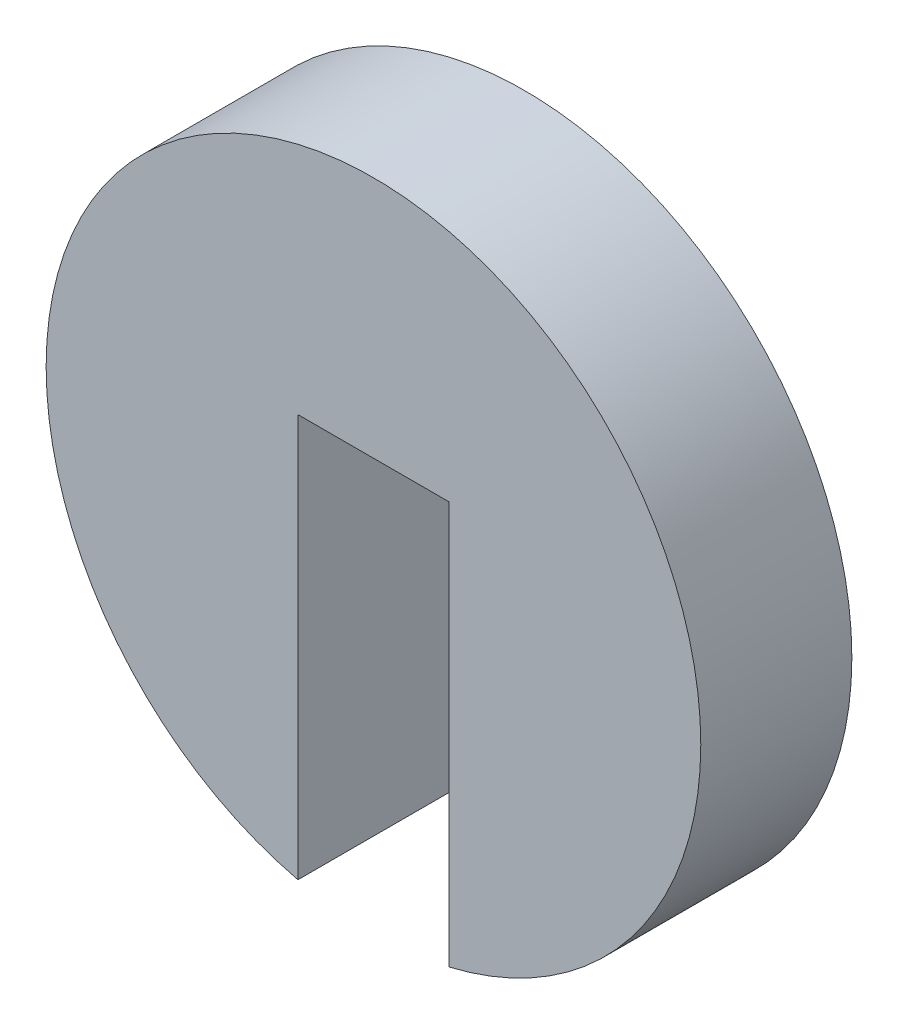
ISO-10303-21;
HEADER;
FILE_DESCRIPTION(('STEP AP214'),'2;1');
FILE_NAME('part.step','',(''),(''),'','','');
FILE_SCHEMA(('AUTOMOTIVE_DESIGN { 1 0 10303 214 1 1 1 1 }'));
ENDSEC;
DATA;
#1=APPLICATION_CONTEXT('core data for automotive mechanical design processes');
#2=APPLICATION_PROTOCOL_DEFINITION('international standard','automotive_design',2000,#1);
#3=PRODUCT_CONTEXT('',#1,'mechanical');
#4=PRODUCT('Part','Part','',(#3));
#5=PRODUCT_RELATED_PRODUCT_CATEGORY('part','',(#4));
#6=PRODUCT_DEFINITION_FORMATION('','',#4);
#7=PRODUCT_DEFINITION_CONTEXT('part definition',#1,'design');
#8=PRODUCT_DEFINITION('design','',#6,#7);
#9=PRODUCT_DEFINITION_SHAPE('','',#8);
#10=(LENGTH_UNIT() NAMED_UNIT(*) SI_UNIT(.MILLI.,.METRE.));
#11=(NAMED_UNIT(*) PLANE_ANGLE_UNIT() SI_UNIT($,.RADIAN.));
#12=(NAMED_UNIT(*) SI_UNIT($,.STERADIAN.) SOLID_ANGLE_UNIT());
#13=UNCERTAINTY_MEASURE_WITH_UNIT(LENGTH_MEASURE(1.E-05),#10,'distance_accuracy_value','');
#14=(GEOMETRIC_REPRESENTATION_CONTEXT(3) GLOBAL_UNCERTAINTY_ASSIGNED_CONTEXT((#13)) GLOBAL_UNIT_ASSIGNED_CONTEXT((#10,
#11,#12)) REPRESENTATION_CONTEXT('',''));
#15=CARTESIAN_POINT('',(0.,0.,0.));
#16=DIRECTION('',(0.,0.,1.));
#17=DIRECTION('',(1.,0.,0.));
#18=AXIS2_PLACEMENT_3D('',#15,#16,#17);
#19=CARTESIAN_POINT('',(0.,0.,3.));
#20=DIRECTION('',(0.,0.,-1.));
#21=DIRECTION('',(-1.,0.,0.));
#22=AXIS2_PLACEMENT_3D('',#19,#20,#21);
#23=CYLINDRICAL_SURFACE('',#22,6.5);
#24=CARTESIAN_POINT('',(0.,0.,0.));
#25=DIRECTION('',(0.,0.,1.));
#26=DIRECTION('',(1.,0.,0.));
#27=AXIS2_PLACEMENT_3D('',#24,#25,#26);
#28=CIRCLE('',#27,6.5);
#29=CARTESIAN_POINT('',(1.5,-6.32455532033676,0.));
#30=VERTEX_POINT('',#29);
#31=CARTESIAN_POINT('',(-1.50000000000002,-6.32455532033676,0.));
#32=VERTEX_POINT('',#31);
#33=EDGE_CURVE('E76',#30,#32,#28,.T.);
#34=ORIENTED_EDGE('',*,*,#33,.T.);
#35=DIRECTION('',(0.,0.,-1.));
#36=VECTOR('',#35,1.);
#37=CARTESIAN_POINT('',(-1.5,-6.32455532033676,3.00000000000001));
#38=LINE('',#37,#36);
#39=CARTESIAN_POINT('',(-1.5,-6.32455532033676,3.00000000000001));
#40=VERTEX_POINT('',#39);
#41=EDGE_CURVE('E11',#40,#32,#38,.T.);
#42=ORIENTED_EDGE('',*,*,#41,.F.);
#43=CARTESIAN_POINT('',(0.,0.,3.));
#44=DIRECTION('',(0.,0.,1.));
#45=DIRECTION('',(1.,0.,0.));
#46=AXIS2_PLACEMENT_3D('',#43,#44,#45);
#47=CIRCLE('',#46,6.5);
#48=CARTESIAN_POINT('',(1.49999999999999,-6.32455532033676,3.));
#49=VERTEX_POINT('',#48);
#50=EDGE_CURVE('E94',#49,#40,#47,.T.);
#51=ORIENTED_EDGE('',*,*,#50,.F.);
#52=DIRECTION('',(0.,0.,-1.));
#53=VECTOR('',#52,1.);
#54=CARTESIAN_POINT('',(1.49999999999999,-6.32455532033676,3.));
#55=LINE('',#54,#53);
#56=EDGE_CURVE('E88',#49,#30,#55,.T.);
#57=ORIENTED_EDGE('',*,*,#56,.T.);
#58=EDGE_LOOP('',(#34,#42,#51,#57));
#59=FACE_BOUND('',#58,.T.);
#60=ADVANCED_FACE('F32',(#59),#23,.T.);
#61=CARTESIAN_POINT('',(-1.50000000000002,1.67544467966323,3.00000000000001));
#62=DIRECTION('',(-1.,0.,0.));
#63=DIRECTION('',(0.,-1.,0.));
#64=AXIS2_PLACEMENT_3D('',#61,#62,#63);
#65=PLANE('',#64);
#66=DIRECTION('',(0.,1.,0.));
#67=VECTOR('',#66,1.);
#68=CARTESIAN_POINT('',(-1.5,1.67544467966325,0.));
#69=LINE('',#68,#67);
#70=CARTESIAN_POINT('',(-1.5,1.67544467966325,0.));
#71=VERTEX_POINT('',#70);
#72=EDGE_CURVE('E72',#32,#71,#69,.T.);
#73=ORIENTED_EDGE('',*,*,#72,.T.);
#74=DIRECTION('',(0.,0.,-1.));
#75=VECTOR('',#74,1.);
#76=CARTESIAN_POINT('',(-1.50000000000002,1.67544467966323,3.00000000000001));
#77=LINE('',#76,#75);
#78=CARTESIAN_POINT('',(-1.50000000000002,1.67544467966323,3.00000000000001));
#79=VERTEX_POINT('',#78);
#80=EDGE_CURVE('E39',#79,#71,#77,.T.);
#81=ORIENTED_EDGE('',*,*,#80,.F.);
#82=DIRECTION('',(0.,1.,0.));
#83=VECTOR('',#82,1.);
#84=CARTESIAN_POINT('',(-1.50000000000002,1.67544467966323,3.00000000000001));
#85=LINE('',#84,#83);
#86=EDGE_CURVE('E84',#40,#79,#85,.T.);
#87=ORIENTED_EDGE('',*,*,#86,.F.);
#88=ORIENTED_EDGE('',*,*,#41,.T.);
#89=EDGE_LOOP('',(#73,#81,#87,#88));
#90=FACE_BOUND('',#89,.T.);
#91=ADVANCED_FACE('F83',(#90),#65,.F.);
#92=CARTESIAN_POINT('',(0.,1.67544467966324,3.00000000000001));
#93=DIRECTION('',(0.,1.,0.));
#94=DIRECTION('',(0.,0.,1.));
#95=AXIS2_PLACEMENT_3D('',#92,#93,#94);
#96=PLANE('',#95);
#97=DIRECTION('',(1.,0.,0.));
#98=VECTOR('',#97,1.);
#99=CARTESIAN_POINT('',(0.,1.67544467966325,0.));
#100=LINE('',#99,#98);
#101=CARTESIAN_POINT('',(1.49999999999999,1.67544467966324,0.));
#102=VERTEX_POINT('',#101);
#103=EDGE_CURVE('E77',#71,#102,#100,.T.);
#104=ORIENTED_EDGE('',*,*,#103,.T.);
#105=DIRECTION('',(0.,0.,-1.));
#106=VECTOR('',#105,1.);
#107=CARTESIAN_POINT('',(1.49999999999999,1.67544467966323,3.00000000000001));
#108=LINE('',#107,#106);
#109=CARTESIAN_POINT('',(1.49999999999999,1.67544467966323,3.00000000000001));
#110=VERTEX_POINT('',#109);
#111=EDGE_CURVE('E100',#110,#102,#108,.T.);
#112=ORIENTED_EDGE('',*,*,#111,.F.);
#113=DIRECTION('',(1.,0.,0.));
#114=VECTOR('',#113,1.);
#115=CARTESIAN_POINT('',(0.,1.67544467966324,3.00000000000001));
#116=LINE('',#115,#114);
#117=EDGE_CURVE('E51',#79,#110,#116,.T.);
#118=ORIENTED_EDGE('',*,*,#117,.F.);
#119=ORIENTED_EDGE('',*,*,#80,.T.);
#120=EDGE_LOOP('',(#104,#112,#118,#119));
#121=FACE_BOUND('',#120,.T.);
#122=ADVANCED_FACE('F103',(#121),#96,.F.);
#123=CARTESIAN_POINT('',(1.49999999999999,1.67544467966323,3.00000000000001));
#124=DIRECTION('',(1.,0.,0.));
#125=DIRECTION('',(0.,1.,0.));
#126=AXIS2_PLACEMENT_3D('',#123,#124,#125);
#127=PLANE('',#126);
#128=DIRECTION('',(0.,-1.,0.));
#129=VECTOR('',#128,1.);
#130=CARTESIAN_POINT('',(1.49999999999999,1.67544467966324,0.));
#131=LINE('',#130,#129);
#132=EDGE_CURVE('E92',#102,#30,#131,.T.);
#133=ORIENTED_EDGE('',*,*,#132,.T.);
#134=ORIENTED_EDGE('',*,*,#56,.F.);
#135=DIRECTION('',(0.,-1.,0.));
#136=VECTOR('',#135,1.);
#137=CARTESIAN_POINT('',(1.49999999999999,1.67544467966323,3.00000000000001));
#138=LINE('',#137,#136);
#139=EDGE_CURVE('E46',#110,#49,#138,.T.);
#140=ORIENTED_EDGE('',*,*,#139,.F.);
#141=ORIENTED_EDGE('',*,*,#111,.T.);
#142=EDGE_LOOP('',(#133,#134,#140,#141));
#143=FACE_BOUND('',#142,.T.);
#144=ADVANCED_FACE('F105',(#143),#127,.F.);
#145=CARTESIAN_POINT('',(0.,0.,3.));
#146=DIRECTION('',(0.,0.,1.));
#147=DIRECTION('',(1.,0.,0.));
#148=AXIS2_PLACEMENT_3D('',#145,#146,#147);
#149=PLANE('',#148);
#150=ORIENTED_EDGE('',*,*,#50,.T.);
#151=ORIENTED_EDGE('',*,*,#86,.T.);
#152=ORIENTED_EDGE('',*,*,#117,.T.);
#153=ORIENTED_EDGE('',*,*,#139,.T.);
#154=EDGE_LOOP('',(#150,#151,#152,#153));
#155=FACE_BOUND('',#154,.T.);
#156=ADVANCED_FACE('F106',(#155),#149,.T.);
#157=CARTESIAN_POINT('',(0.,0.,0.));
#158=DIRECTION('',(0.,0.,1.));
#159=DIRECTION('',(1.,0.,0.));
#160=AXIS2_PLACEMENT_3D('',#157,#158,#159);
#161=PLANE('',#160);
#162=ORIENTED_EDGE('',*,*,#33,.F.);
#163=ORIENTED_EDGE('',*,*,#132,.F.);
#164=ORIENTED_EDGE('',*,*,#103,.F.);
#165=ORIENTED_EDGE('',*,*,#72,.F.);
#166=EDGE_LOOP('',(#162,#163,#164,#165));
#167=FACE_BOUND('',#166,.T.);
#168=ADVANCED_FACE('F73',(#167),#161,.F.);
#169=CLOSED_SHELL('',(#60,#91,#122,#144,#156,#168));
#170=MANIFOLD_SOLID_BREP('B2',#169);
#171=ADVANCED_BREP_SHAPE_REPRESENTATION('',(#18,#170),#14);
#172=SHAPE_DEFINITION_REPRESENTATION(#9,#171);
ENDSEC;
END-ISO-10303-21;
